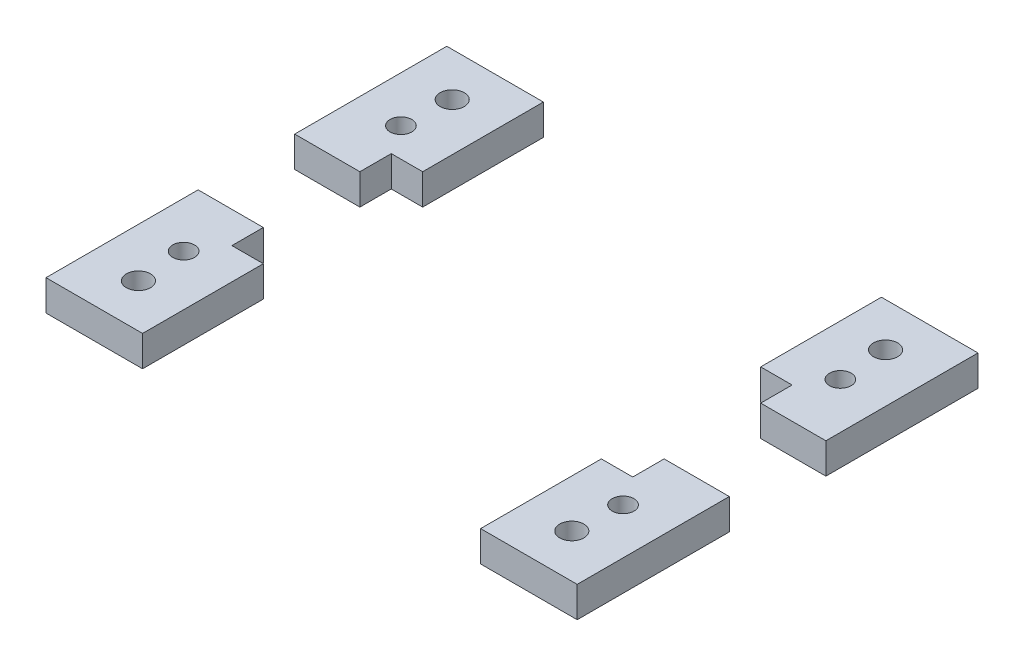
ISO-10303-21;
HEADER;
FILE_DESCRIPTION(('STEP AP214'),'2;1');
FILE_NAME('part.step','',(''),(''),'','','');
FILE_SCHEMA(('AUTOMOTIVE_DESIGN { 1 0 10303 214 1 1 1 1 }'));
ENDSEC;
DATA;
#1=APPLICATION_CONTEXT('core data for automotive mechanical design processes');
#2=APPLICATION_PROTOCOL_DEFINITION('international standard','automotive_design',2000,#1);
#3=PRODUCT_CONTEXT('',#1,'mechanical');
#4=PRODUCT('Part','Part','',(#3));
#5=PRODUCT_RELATED_PRODUCT_CATEGORY('part','',(#4));
#6=PRODUCT_DEFINITION_FORMATION('','',#4);
#7=PRODUCT_DEFINITION_CONTEXT('part definition',#1,'design');
#8=PRODUCT_DEFINITION('design','',#6,#7);
#9=PRODUCT_DEFINITION_SHAPE('','',#8);
#10=(LENGTH_UNIT() NAMED_UNIT(*) SI_UNIT(.MILLI.,.METRE.));
#11=(NAMED_UNIT(*) PLANE_ANGLE_UNIT() SI_UNIT($,.RADIAN.));
#12=(NAMED_UNIT(*) SI_UNIT($,.STERADIAN.) SOLID_ANGLE_UNIT());
#13=UNCERTAINTY_MEASURE_WITH_UNIT(LENGTH_MEASURE(1.E-05),#10,'distance_accuracy_value','');
#14=(GEOMETRIC_REPRESENTATION_CONTEXT(3) GLOBAL_UNCERTAINTY_ASSIGNED_CONTEXT((#13)) GLOBAL_UNIT_ASSIGNED_CONTEXT((#10,
#11,#12)) REPRESENTATION_CONTEXT('',''));
#15=CARTESIAN_POINT('',(0.,0.,0.));
#16=DIRECTION('',(0.,0.,1.));
#17=DIRECTION('',(1.,0.,0.));
#18=AXIS2_PLACEMENT_3D('',#15,#16,#17);
#19=CARTESIAN_POINT('',(-41.5,-3.175,-41.5));
#20=DIRECTION('',(0.,0.,-1.));
#21=DIRECTION('',(-1.,0.,0.));
#22=AXIS2_PLACEMENT_3D('',#19,#20,#21);
#23=PLANE('',#22);
#24=DIRECTION('',(0.,-1.,0.));
#25=VECTOR('',#24,1.);
#26=CARTESIAN_POINT('',(-55.,3.175,-41.5));
#27=LINE('',#26,#25);
#28=CARTESIAN_POINT('',(-55.,3.175,-41.5));
#29=VERTEX_POINT('',#28);
#30=CARTESIAN_POINT('',(-55.,-3.175,-41.5));
#31=VERTEX_POINT('',#30);
#32=EDGE_CURVE('E486',#29,#31,#27,.T.);
#33=ORIENTED_EDGE('',*,*,#32,.F.);
#34=DIRECTION('',(-1.,0.,0.));
#35=VECTOR('',#34,1.);
#36=CARTESIAN_POINT('',(-41.5,3.175,-41.5));
#37=LINE('',#36,#35);
#38=CARTESIAN_POINT('',(-35.,3.175,-41.5));
#39=VERTEX_POINT('',#38);
#40=EDGE_CURVE('E559',#39,#29,#37,.T.);
#41=ORIENTED_EDGE('',*,*,#40,.F.);
#42=DIRECTION('',(0.,1.,0.));
#43=VECTOR('',#42,1.);
#44=CARTESIAN_POINT('',(-35.,-3.175,-41.5));
#45=LINE('',#44,#43);
#46=CARTESIAN_POINT('',(-35.,-3.175,-41.5));
#47=VERTEX_POINT('',#46);
#48=EDGE_CURVE('E569',#47,#39,#45,.T.);
#49=ORIENTED_EDGE('',*,*,#48,.F.);
#50=DIRECTION('',(-1.,0.,0.));
#51=VECTOR('',#50,1.);
#52=CARTESIAN_POINT('',(-41.5,-3.175,-41.5));
#53=LINE('',#52,#51);
#54=EDGE_CURVE('E556',#47,#31,#53,.T.);
#55=ORIENTED_EDGE('',*,*,#54,.T.);
#56=EDGE_LOOP('',(#33,#41,#49,#55));
#57=FACE_BOUND('',#56,.T.);
#58=ADVANCED_FACE('F476',(#57),#23,.T.);
#59=CARTESIAN_POINT('',(0.,-3.175,0.));
#60=DIRECTION('',(0.,1.,0.));
#61=DIRECTION('',(0.,0.,1.));
#62=AXIS2_PLACEMENT_3D('',#59,#60,#61);
#63=PLANE('',#62);
#64=CARTESIAN_POINT('',(-45.5,-3.175,-22.5));
#65=DIRECTION('',(0.,1.,0.));
#66=DIRECTION('',(0.,0.,1.));
#67=AXIS2_PLACEMENT_3D('',#64,#65,#66);
#68=CIRCLE('',#67,2.25);
#69=CARTESIAN_POINT('',(-45.5,-3.175,-20.25));
#70=VERTEX_POINT('',#69);
#71=EDGE_CURVE('E583',#70,#70,#68,.T.);
#72=ORIENTED_EDGE('',*,*,#71,.T.);
#73=EDGE_LOOP('',(#72));
#74=FACE_BOUND('',#73,.T.);
#75=CARTESIAN_POINT('',(-44.8716223944726,-3.175,-32.4880942852371));
#76=DIRECTION('',(0.,1.,0.));
#77=DIRECTION('',(0.,0.,1.));
#78=AXIS2_PLACEMENT_3D('',#75,#76,#77);
#79=CIRCLE('',#78,2.5);
#80=CARTESIAN_POINT('',(-44.8716223944726,-3.175,-29.9880942852371));
#81=VERTEX_POINT('',#80);
#82=EDGE_CURVE('E584',#81,#81,#79,.T.);
#83=ORIENTED_EDGE('',*,*,#82,.T.);
#84=EDGE_LOOP('',(#83));
#85=FACE_BOUND('',#84,.T.);
#86=DIRECTION('',(0.,0.,1.));
#87=VECTOR('',#86,1.);
#88=CARTESIAN_POINT('',(-41.5,-3.175,-16.5));
#89=LINE('',#88,#87);
#90=CARTESIAN_POINT('',(-41.5,-3.175,-16.5));
#91=VERTEX_POINT('',#90);
#92=CARTESIAN_POINT('',(-41.5,-3.175,-10.));
#93=VERTEX_POINT('',#92);
#94=EDGE_CURVE('E480',#91,#93,#89,.T.);
#95=ORIENTED_EDGE('',*,*,#94,.T.);
#96=DIRECTION('',(1.,0.,0.));
#97=VECTOR('',#96,1.);
#98=CARTESIAN_POINT('',(0.,-3.175,-10.));
#99=LINE('',#98,#97);
#100=CARTESIAN_POINT('',(-55.,-3.175,-10.));
#101=VERTEX_POINT('',#100);
#102=EDGE_CURVE('E530',#101,#93,#99,.T.);
#103=ORIENTED_EDGE('',*,*,#102,.F.);
#104=DIRECTION('',(0.,0.,1.));
#105=VECTOR('',#104,1.);
#106=CARTESIAN_POINT('',(-55.,-3.175,0.));
#107=LINE('',#106,#105);
#108=EDGE_CURVE('E13',#31,#101,#107,.T.);
#109=ORIENTED_EDGE('',*,*,#108,.F.);
#110=ORIENTED_EDGE('',*,*,#54,.F.);
#111=DIRECTION('',(0.,0.,-1.));
#112=VECTOR('',#111,1.);
#113=CARTESIAN_POINT('',(-35.,-3.175,0.));
#114=LINE('',#113,#112);
#115=CARTESIAN_POINT('',(-35.,-3.175,-16.5));
#116=VERTEX_POINT('',#115);
#117=EDGE_CURVE('E533',#116,#47,#114,.T.);
#118=ORIENTED_EDGE('',*,*,#117,.F.);
#119=DIRECTION('',(-1.,0.,0.));
#120=VECTOR('',#119,1.);
#121=CARTESIAN_POINT('',(-41.5,-3.175,-16.5));
#122=LINE('',#121,#120);
#123=EDGE_CURVE('E547',#116,#91,#122,.T.);
#124=ORIENTED_EDGE('',*,*,#123,.T.);
#125=EDGE_LOOP('',(#95,#103,#109,#110,#118,#124));
#126=FACE_BOUND('',#125,.T.);
#127=ADVANCED_FACE('F478',(#74,#85,#126),#63,.F.);
#128=CARTESIAN_POINT('',(-41.5,-3.175,-16.5));
#129=DIRECTION('',(-1.,0.,0.));
#130=DIRECTION('',(0.,0.,1.));
#131=AXIS2_PLACEMENT_3D('',#128,#129,#130);
#132=PLANE('',#131);
#133=DIRECTION('',(0.,0.,1.));
#134=VECTOR('',#133,1.);
#135=CARTESIAN_POINT('',(-41.5,3.175,-16.5));
#136=LINE('',#135,#134);
#137=CARTESIAN_POINT('',(-41.5,3.175,-16.5));
#138=VERTEX_POINT('',#137);
#139=CARTESIAN_POINT('',(-41.5,3.175,-10.));
#140=VERTEX_POINT('',#139);
#141=EDGE_CURVE('E544',#138,#140,#136,.T.);
#142=ORIENTED_EDGE('',*,*,#141,.T.);
#143=DIRECTION('',(0.,-1.,0.));
#144=VECTOR('',#143,1.);
#145=CARTESIAN_POINT('',(-41.5,-3.175,-10.));
#146=LINE('',#145,#144);
#147=EDGE_CURVE('E546',#140,#93,#146,.T.);
#148=ORIENTED_EDGE('',*,*,#147,.T.);
#149=ORIENTED_EDGE('',*,*,#94,.F.);
#150=DIRECTION('',(0.,1.,0.));
#151=VECTOR('',#150,1.);
#152=CARTESIAN_POINT('',(-41.5,-3.175,-16.5));
#153=LINE('',#152,#151);
#154=EDGE_CURVE('E551',#91,#138,#153,.T.);
#155=ORIENTED_EDGE('',*,*,#154,.T.);
#156=EDGE_LOOP('',(#142,#148,#149,#155));
#157=FACE_BOUND('',#156,.T.);
#158=ADVANCED_FACE('F610',(#157),#132,.F.);
#159=CARTESIAN_POINT('',(-41.5,-3.175,-16.5));
#160=DIRECTION('',(0.,0.,-1.));
#161=DIRECTION('',(-1.,0.,0.));
#162=AXIS2_PLACEMENT_3D('',#159,#160,#161);
#163=PLANE('',#162);
#164=ORIENTED_EDGE('',*,*,#123,.F.);
#165=DIRECTION('',(0.,1.,0.));
#166=VECTOR('',#165,1.);
#167=CARTESIAN_POINT('',(-35.,-3.175,-16.5));
#168=LINE('',#167,#166);
#169=CARTESIAN_POINT('',(-35.,3.175,-16.5));
#170=VERTEX_POINT('',#169);
#171=EDGE_CURVE('E565',#116,#170,#168,.T.);
#172=ORIENTED_EDGE('',*,*,#171,.T.);
#173=DIRECTION('',(-1.,0.,0.));
#174=VECTOR('',#173,1.);
#175=CARTESIAN_POINT('',(-41.5,3.175,-16.5));
#176=LINE('',#175,#174);
#177=EDGE_CURVE('E568',#170,#138,#176,.T.);
#178=ORIENTED_EDGE('',*,*,#177,.T.);
#179=ORIENTED_EDGE('',*,*,#154,.F.);
#180=EDGE_LOOP('',(#164,#172,#178,#179));
#181=FACE_BOUND('',#180,.T.);
#182=ADVANCED_FACE('F612',(#181),#163,.F.);
#183=CARTESIAN_POINT('',(0.,3.175,0.));
#184=DIRECTION('',(0.,1.,0.));
#185=DIRECTION('',(0.,0.,1.));
#186=AXIS2_PLACEMENT_3D('',#183,#184,#185);
#187=PLANE('',#186);
#188=CARTESIAN_POINT('',(-45.5,3.175,-22.5));
#189=DIRECTION('',(0.,1.,0.));
#190=DIRECTION('',(0.,0.,1.));
#191=AXIS2_PLACEMENT_3D('',#188,#189,#190);
#192=CIRCLE('',#191,2.25);
#193=CARTESIAN_POINT('',(-45.5,3.175,-20.25));
#194=VERTEX_POINT('',#193);
#195=EDGE_CURVE('E562',#194,#194,#192,.T.);
#196=ORIENTED_EDGE('',*,*,#195,.F.);
#197=EDGE_LOOP('',(#196));
#198=FACE_BOUND('',#197,.T.);
#199=CARTESIAN_POINT('',(-44.8716223944726,3.175,-32.4880942852371));
#200=DIRECTION('',(0.,1.,0.));
#201=DIRECTION('',(0.,0.,1.));
#202=AXIS2_PLACEMENT_3D('',#199,#200,#201);
#203=CIRCLE('',#202,2.5);
#204=CARTESIAN_POINT('',(-44.8716223944726,3.175,-29.9880942852371));
#205=VERTEX_POINT('',#204);
#206=EDGE_CURVE('E580',#205,#205,#203,.T.);
#207=ORIENTED_EDGE('',*,*,#206,.F.);
#208=EDGE_LOOP('',(#207));
#209=FACE_BOUND('',#208,.T.);
#210=DIRECTION('',(1.,0.,0.));
#211=VECTOR('',#210,1.);
#212=CARTESIAN_POINT('',(0.,3.175,-10.));
#213=LINE('',#212,#211);
#214=CARTESIAN_POINT('',(-55.,3.175,-10.));
#215=VERTEX_POINT('',#214);
#216=EDGE_CURVE('E525',#215,#140,#213,.T.);
#217=ORIENTED_EDGE('',*,*,#216,.T.);
#218=ORIENTED_EDGE('',*,*,#141,.F.);
#219=ORIENTED_EDGE('',*,*,#177,.F.);
#220=DIRECTION('',(0.,0.,1.));
#221=VECTOR('',#220,1.);
#222=CARTESIAN_POINT('',(-35.,3.175,0.));
#223=LINE('',#222,#221);
#224=EDGE_CURVE('E564',#39,#170,#223,.T.);
#225=ORIENTED_EDGE('',*,*,#224,.F.);
#226=ORIENTED_EDGE('',*,*,#40,.T.);
#227=DIRECTION('',(0.,0.,1.));
#228=VECTOR('',#227,1.);
#229=CARTESIAN_POINT('',(-55.,3.175,0.));
#230=LINE('',#229,#228);
#231=EDGE_CURVE('E571',#29,#215,#230,.T.);
#232=ORIENTED_EDGE('',*,*,#231,.T.);
#233=EDGE_LOOP('',(#217,#218,#219,#225,#226,#232));
#234=FACE_BOUND('',#233,.T.);
#235=ADVANCED_FACE('F615',(#198,#209,#234),#187,.T.);
#236=CARTESIAN_POINT('',(-35.,3.175,0.));
#237=DIRECTION('',(-1.,0.,0.));
#238=DIRECTION('',(0.,0.,1.));
#239=AXIS2_PLACEMENT_3D('',#236,#237,#238);
#240=PLANE('',#239);
#241=ORIENTED_EDGE('',*,*,#48,.T.);
#242=ORIENTED_EDGE('',*,*,#224,.T.);
#243=ORIENTED_EDGE('',*,*,#171,.F.);
#244=ORIENTED_EDGE('',*,*,#117,.T.);
#245=EDGE_LOOP('',(#241,#242,#243,#244));
#246=FACE_BOUND('',#245,.T.);
#247=ADVANCED_FACE('F616',(#246),#240,.F.);
#248=CARTESIAN_POINT('',(0.,3.175,-10.));
#249=DIRECTION('',(0.,0.,-1.));
#250=DIRECTION('',(-1.,0.,0.));
#251=AXIS2_PLACEMENT_3D('',#248,#249,#250);
#252=PLANE('',#251);
#253=ORIENTED_EDGE('',*,*,#216,.F.);
#254=DIRECTION('',(0.,-1.,0.));
#255=VECTOR('',#254,1.);
#256=CARTESIAN_POINT('',(-55.,3.175,-10.));
#257=LINE('',#256,#255);
#258=EDGE_CURVE('E527',#215,#101,#257,.T.);
#259=ORIENTED_EDGE('',*,*,#258,.T.);
#260=ORIENTED_EDGE('',*,*,#102,.T.);
#261=ORIENTED_EDGE('',*,*,#147,.F.);
#262=EDGE_LOOP('',(#253,#259,#260,#261));
#263=FACE_BOUND('',#262,.T.);
#264=ADVANCED_FACE('F528',(#263),#252,.F.);
#265=CARTESIAN_POINT('',(-55.,3.175,0.));
#266=DIRECTION('',(1.,0.,0.));
#267=DIRECTION('',(0.,0.,-1.));
#268=AXIS2_PLACEMENT_3D('',#265,#266,#267);
#269=PLANE('',#268);
#270=ORIENTED_EDGE('',*,*,#258,.F.);
#271=ORIENTED_EDGE('',*,*,#231,.F.);
#272=ORIENTED_EDGE('',*,*,#32,.T.);
#273=ORIENTED_EDGE('',*,*,#108,.T.);
#274=EDGE_LOOP('',(#270,#271,#272,#273));
#275=FACE_BOUND('',#274,.T.);
#276=ADVANCED_FACE('F535',(#275),#269,.F.);
#277=CARTESIAN_POINT('',(-44.8716223944726,3.175,-32.4880942852371));
#278=DIRECTION('',(0.,-1.,0.));
#279=DIRECTION('',(0.,0.,-1.));
#280=AXIS2_PLACEMENT_3D('',#277,#278,#279);
#281=CYLINDRICAL_SURFACE('',#280,2.5);
#282=ORIENTED_EDGE('',*,*,#206,.T.);
#283=EDGE_LOOP('',(#282));
#284=FACE_BOUND('',#283,.T.);
#285=ORIENTED_EDGE('',*,*,#82,.F.);
#286=EDGE_LOOP('',(#285));
#287=FACE_BOUND('',#286,.T.);
#288=ADVANCED_FACE('F596',(#284,#287),#281,.F.);
#289=CARTESIAN_POINT('',(-45.5,3.175,-22.5));
#290=DIRECTION('',(0.,-1.,0.));
#291=DIRECTION('',(0.,0.,-1.));
#292=AXIS2_PLACEMENT_3D('',#289,#290,#291);
#293=CYLINDRICAL_SURFACE('',#292,2.25);
#294=ORIENTED_EDGE('',*,*,#195,.T.);
#295=EDGE_LOOP('',(#294));
#296=FACE_BOUND('',#295,.T.);
#297=ORIENTED_EDGE('',*,*,#71,.F.);
#298=EDGE_LOOP('',(#297));
#299=FACE_BOUND('',#298,.T.);
#300=ADVANCED_FACE('F594',(#296,#299),#293,.F.);
#301=CLOSED_SHELL('',(#58,#127,#158,#182,#235,#247,#264,#276,#288,#300));
#302=MANIFOLD_SOLID_BREP('B2',#301);
#303=CARTESIAN_POINT('',(41.5,-3.175,-16.5));
#304=DIRECTION('',(1.,0.,0.));
#305=DIRECTION('',(0.,0.,-1.));
#306=AXIS2_PLACEMENT_3D('',#303,#304,#305);
#307=PLANE('',#306);
#308=DIRECTION('',(0.,1.,0.));
#309=VECTOR('',#308,1.);
#310=CARTESIAN_POINT('',(41.5,-3.175,10.));
#311=LINE('',#310,#309);
#312=CARTESIAN_POINT('',(41.5,-3.175,10.));
#313=VERTEX_POINT('',#312);
#314=CARTESIAN_POINT('',(41.5,3.175,10.));
#315=VERTEX_POINT('',#314);
#316=EDGE_CURVE('E797',#313,#315,#311,.T.);
#317=ORIENTED_EDGE('',*,*,#316,.F.);
#318=DIRECTION('',(0.,0.,-1.));
#319=VECTOR('',#318,1.);
#320=CARTESIAN_POINT('',(41.5,-3.175,-16.5));
#321=LINE('',#320,#319);
#322=CARTESIAN_POINT('',(41.5,-3.175,16.5));
#323=VERTEX_POINT('',#322);
#324=EDGE_CURVE('E794',#323,#313,#321,.T.);
#325=ORIENTED_EDGE('',*,*,#324,.F.);
#326=DIRECTION('',(0.,1.,0.));
#327=VECTOR('',#326,1.);
#328=CARTESIAN_POINT('',(41.5,-3.175,16.5));
#329=LINE('',#328,#327);
#330=CARTESIAN_POINT('',(41.5,3.175,16.5));
#331=VERTEX_POINT('',#330);
#332=EDGE_CURVE('E789',#323,#331,#329,.T.);
#333=ORIENTED_EDGE('',*,*,#332,.T.);
#334=DIRECTION('',(0.,0.,-1.));
#335=VECTOR('',#334,1.);
#336=CARTESIAN_POINT('',(41.5,3.175,-16.5));
#337=LINE('',#336,#335);
#338=EDGE_CURVE('E707',#331,#315,#337,.T.);
#339=ORIENTED_EDGE('',*,*,#338,.T.);
#340=EDGE_LOOP('',(#317,#325,#333,#339));
#341=FACE_BOUND('',#340,.T.);
#342=ADVANCED_FACE('F704',(#341),#307,.F.);
#343=CARTESIAN_POINT('',(0.,3.175,0.));
#344=DIRECTION('',(0.,1.,0.));
#345=DIRECTION('',(0.,0.,1.));
#346=AXIS2_PLACEMENT_3D('',#343,#344,#345);
#347=PLANE('',#346);
#348=CARTESIAN_POINT('',(45.5,3.175,22.5));
#349=DIRECTION('',(0.,1.,0.));
#350=DIRECTION('',(0.,0.,1.));
#351=AXIS2_PLACEMENT_3D('',#348,#349,#350);
#352=CIRCLE('',#351,2.25000000000001);
#353=CARTESIAN_POINT('',(45.5,3.175,24.75));
#354=VERTEX_POINT('',#353);
#355=EDGE_CURVE('E792',#354,#354,#352,.T.);
#356=ORIENTED_EDGE('',*,*,#355,.F.);
#357=EDGE_LOOP('',(#356));
#358=FACE_BOUND('',#357,.T.);
#359=CARTESIAN_POINT('',(44.8716223944726,3.175,32.4880942852371));
#360=DIRECTION('',(0.,1.,0.));
#361=DIRECTION('',(0.,0.,1.));
#362=AXIS2_PLACEMENT_3D('',#359,#360,#361);
#363=CIRCLE('',#362,2.5);
#364=CARTESIAN_POINT('',(44.8716223944726,3.175,34.9880942852371));
#365=VERTEX_POINT('',#364);
#366=EDGE_CURVE('E908',#365,#365,#363,.T.);
#367=ORIENTED_EDGE('',*,*,#366,.F.);
#368=EDGE_LOOP('',(#367));
#369=FACE_BOUND('',#368,.T.);
#370=DIRECTION('',(0.,0.,-1.));
#371=VECTOR('',#370,1.);
#372=CARTESIAN_POINT('',(55.,3.175,0.));
#373=LINE('',#372,#371);
#374=CARTESIAN_POINT('',(55.,3.175,41.5));
#375=VERTEX_POINT('',#374);
#376=CARTESIAN_POINT('',(55.,3.175,10.));
#377=VERTEX_POINT('',#376);
#378=EDGE_CURVE('E741',#375,#377,#373,.T.);
#379=ORIENTED_EDGE('',*,*,#378,.T.);
#380=DIRECTION('',(1.,0.,0.));
#381=VECTOR('',#380,1.);
#382=CARTESIAN_POINT('',(0.,3.175,10.));
#383=LINE('',#382,#381);
#384=EDGE_CURVE('E713',#315,#377,#383,.T.);
#385=ORIENTED_EDGE('',*,*,#384,.F.);
#386=ORIENTED_EDGE('',*,*,#338,.F.);
#387=DIRECTION('',(1.,0.,0.));
#388=VECTOR('',#387,1.);
#389=CARTESIAN_POINT('',(-41.5,3.175,16.5));
#390=LINE('',#389,#388);
#391=CARTESIAN_POINT('',(35.,3.175,16.5));
#392=VERTEX_POINT('',#391);
#393=EDGE_CURVE('E779',#392,#331,#390,.T.);
#394=ORIENTED_EDGE('',*,*,#393,.F.);
#395=DIRECTION('',(0.,0.,1.));
#396=VECTOR('',#395,1.);
#397=CARTESIAN_POINT('',(35.,3.175,0.));
#398=LINE('',#397,#396);
#399=CARTESIAN_POINT('',(35.,3.175,41.5));
#400=VERTEX_POINT('',#399);
#401=EDGE_CURVE('E787',#392,#400,#398,.T.);
#402=ORIENTED_EDGE('',*,*,#401,.T.);
#403=DIRECTION('',(1.,0.,0.));
#404=VECTOR('',#403,1.);
#405=CARTESIAN_POINT('',(-41.5,3.175,41.5));
#406=LINE('',#405,#404);
#407=EDGE_CURVE('E778',#400,#375,#406,.T.);
#408=ORIENTED_EDGE('',*,*,#407,.T.);
#409=EDGE_LOOP('',(#379,#385,#386,#394,#402,#408));
#410=FACE_BOUND('',#409,.T.);
#411=ADVANCED_FACE('F812',(#358,#369,#410),#347,.T.);
#412=CARTESIAN_POINT('',(0.,-3.175,0.));
#413=DIRECTION('',(0.,1.,0.));
#414=DIRECTION('',(0.,0.,1.));
#415=AXIS2_PLACEMENT_3D('',#412,#413,#414);
#416=PLANE('',#415);
#417=CARTESIAN_POINT('',(45.5,-3.175,22.5));
#418=DIRECTION('',(0.,1.,0.));
#419=DIRECTION('',(0.,0.,1.));
#420=AXIS2_PLACEMENT_3D('',#417,#418,#419);
#421=CIRCLE('',#420,2.25000000000001);
#422=CARTESIAN_POINT('',(45.5,-3.175,24.75));
#423=VERTEX_POINT('',#422);
#424=EDGE_CURVE('E907',#423,#423,#421,.T.);
#425=ORIENTED_EDGE('',*,*,#424,.T.);
#426=EDGE_LOOP('',(#425));
#427=FACE_BOUND('',#426,.T.);
#428=CARTESIAN_POINT('',(44.8716223944726,-3.175,32.4880942852371));
#429=DIRECTION('',(0.,1.,0.));
#430=DIRECTION('',(0.,0.,1.));
#431=AXIS2_PLACEMENT_3D('',#428,#429,#430);
#432=CIRCLE('',#431,2.5);
#433=CARTESIAN_POINT('',(44.8716223944726,-3.175,34.9880942852371));
#434=VERTEX_POINT('',#433);
#435=EDGE_CURVE('E912',#434,#434,#432,.T.);
#436=ORIENTED_EDGE('',*,*,#435,.T.);
#437=EDGE_LOOP('',(#436));
#438=FACE_BOUND('',#437,.T.);
#439=DIRECTION('',(1.,0.,0.));
#440=VECTOR('',#439,1.);
#441=CARTESIAN_POINT('',(0.,-3.175,10.));
#442=LINE('',#441,#440);
#443=CARTESIAN_POINT('',(55.,-3.175,10.));
#444=VERTEX_POINT('',#443);
#445=EDGE_CURVE('E720',#313,#444,#442,.T.);
#446=ORIENTED_EDGE('',*,*,#445,.T.);
#447=DIRECTION('',(0.,0.,-1.));
#448=VECTOR('',#447,1.);
#449=CARTESIAN_POINT('',(55.,-3.175,0.));
#450=LINE('',#449,#448);
#451=CARTESIAN_POINT('',(55.,-3.175,41.5));
#452=VERTEX_POINT('',#451);
#453=EDGE_CURVE('E782',#452,#444,#450,.T.);
#454=ORIENTED_EDGE('',*,*,#453,.F.);
#455=DIRECTION('',(1.,0.,0.));
#456=VECTOR('',#455,1.);
#457=CARTESIAN_POINT('',(-41.5,-3.175,41.5));
#458=LINE('',#457,#456);
#459=CARTESIAN_POINT('',(35.,-3.175,41.5));
#460=VERTEX_POINT('',#459);
#461=EDGE_CURVE('E776',#460,#452,#458,.T.);
#462=ORIENTED_EDGE('',*,*,#461,.F.);
#463=DIRECTION('',(0.,0.,-1.));
#464=VECTOR('',#463,1.);
#465=CARTESIAN_POINT('',(35.,-3.175,0.));
#466=LINE('',#465,#464);
#467=CARTESIAN_POINT('',(35.,-3.175,16.5));
#468=VERTEX_POINT('',#467);
#469=EDGE_CURVE('E760',#460,#468,#466,.T.);
#470=ORIENTED_EDGE('',*,*,#469,.T.);
#471=DIRECTION('',(1.,0.,0.));
#472=VECTOR('',#471,1.);
#473=CARTESIAN_POINT('',(-41.5,-3.175,16.5));
#474=LINE('',#473,#472);
#475=EDGE_CURVE('E770',#468,#323,#474,.T.);
#476=ORIENTED_EDGE('',*,*,#475,.T.);
#477=ORIENTED_EDGE('',*,*,#324,.T.);
#478=EDGE_LOOP('',(#446,#454,#462,#470,#476,#477));
#479=FACE_BOUND('',#478,.T.);
#480=ADVANCED_FACE('F781',(#427,#438,#479),#416,.F.);
#481=CARTESIAN_POINT('',(-41.5,-3.175,16.5));
#482=DIRECTION('',(0.,0.,1.));
#483=DIRECTION('',(1.,0.,0.));
#484=AXIS2_PLACEMENT_3D('',#481,#482,#483);
#485=PLANE('',#484);
#486=DIRECTION('',(0.,-1.,0.));
#487=VECTOR('',#486,1.);
#488=CARTESIAN_POINT('',(35.,-3.175,16.5));
#489=LINE('',#488,#487);
#490=EDGE_CURVE('E766',#392,#468,#489,.T.);
#491=ORIENTED_EDGE('',*,*,#490,.F.);
#492=ORIENTED_EDGE('',*,*,#393,.T.);
#493=ORIENTED_EDGE('',*,*,#332,.F.);
#494=ORIENTED_EDGE('',*,*,#475,.F.);
#495=EDGE_LOOP('',(#491,#492,#493,#494));
#496=FACE_BOUND('',#495,.T.);
#497=ADVANCED_FACE('F815',(#496),#485,.F.);
#498=CARTESIAN_POINT('',(-41.5,-3.175,41.5));
#499=DIRECTION('',(0.,0.,1.));
#500=DIRECTION('',(1.,0.,0.));
#501=AXIS2_PLACEMENT_3D('',#498,#499,#500);
#502=PLANE('',#501);
#503=DIRECTION('',(0.,-1.,0.));
#504=VECTOR('',#503,1.);
#505=CARTESIAN_POINT('',(55.,3.175,41.5));
#506=LINE('',#505,#504);
#507=EDGE_CURVE('E735',#375,#452,#506,.T.);
#508=ORIENTED_EDGE('',*,*,#507,.F.);
#509=ORIENTED_EDGE('',*,*,#407,.F.);
#510=DIRECTION('',(0.,-1.,0.));
#511=VECTOR('',#510,1.);
#512=CARTESIAN_POINT('',(35.,-3.175,41.5));
#513=LINE('',#512,#511);
#514=EDGE_CURVE('E763',#400,#460,#513,.T.);
#515=ORIENTED_EDGE('',*,*,#514,.T.);
#516=ORIENTED_EDGE('',*,*,#461,.T.);
#517=EDGE_LOOP('',(#508,#509,#515,#516));
#518=FACE_BOUND('',#517,.T.);
#519=ADVANCED_FACE('F775',(#518),#502,.T.);
#520=CARTESIAN_POINT('',(35.,3.175,0.));
#521=DIRECTION('',(-1.,0.,0.));
#522=DIRECTION('',(0.,0.,1.));
#523=AXIS2_PLACEMENT_3D('',#520,#521,#522);
#524=PLANE('',#523);
#525=ORIENTED_EDGE('',*,*,#401,.F.);
#526=ORIENTED_EDGE('',*,*,#490,.T.);
#527=ORIENTED_EDGE('',*,*,#469,.F.);
#528=ORIENTED_EDGE('',*,*,#514,.F.);
#529=EDGE_LOOP('',(#525,#526,#527,#528));
#530=FACE_BOUND('',#529,.T.);
#531=ADVANCED_FACE('F762',(#530),#524,.T.);
#532=CARTESIAN_POINT('',(55.,3.175,0.));
#533=DIRECTION('',(-1.,0.,0.));
#534=DIRECTION('',(0.,0.,1.));
#535=AXIS2_PLACEMENT_3D('',#532,#533,#534);
#536=PLANE('',#535);
#537=DIRECTION('',(0.,-1.,0.));
#538=VECTOR('',#537,1.);
#539=CARTESIAN_POINT('',(55.,3.175,10.));
#540=LINE('',#539,#538);
#541=EDGE_CURVE('E474',#377,#444,#540,.T.);
#542=ORIENTED_EDGE('',*,*,#541,.F.);
#543=ORIENTED_EDGE('',*,*,#378,.F.);
#544=ORIENTED_EDGE('',*,*,#507,.T.);
#545=ORIENTED_EDGE('',*,*,#453,.T.);
#546=EDGE_LOOP('',(#542,#543,#544,#545));
#547=FACE_BOUND('',#546,.T.);
#548=ADVANCED_FACE('F836',(#547),#536,.F.);
#549=CARTESIAN_POINT('',(0.,3.175,10.));
#550=DIRECTION('',(0.,0.,-1.));
#551=DIRECTION('',(-1.,0.,0.));
#552=AXIS2_PLACEMENT_3D('',#549,#550,#551);
#553=PLANE('',#552);
#554=ORIENTED_EDGE('',*,*,#316,.T.);
#555=ORIENTED_EDGE('',*,*,#384,.T.);
#556=ORIENTED_EDGE('',*,*,#541,.T.);
#557=ORIENTED_EDGE('',*,*,#445,.F.);
#558=EDGE_LOOP('',(#554,#555,#556,#557));
#559=FACE_BOUND('',#558,.T.);
#560=ADVANCED_FACE('F810',(#559),#553,.T.);
#561=CARTESIAN_POINT('',(44.8716223944726,3.175,32.4880942852371));
#562=DIRECTION('',(0.,-1.,0.));
#563=DIRECTION('',(0.,0.,-1.));
#564=AXIS2_PLACEMENT_3D('',#561,#562,#563);
#565=CYLINDRICAL_SURFACE('',#564,2.5);
#566=ORIENTED_EDGE('',*,*,#366,.T.);
#567=EDGE_LOOP('',(#566));
#568=FACE_BOUND('',#567,.T.);
#569=ORIENTED_EDGE('',*,*,#435,.F.);
#570=EDGE_LOOP('',(#569));
#571=FACE_BOUND('',#570,.T.);
#572=ADVANCED_FACE('F840',(#568,#571),#565,.F.);
#573=CARTESIAN_POINT('',(45.5,3.175,22.5));
#574=DIRECTION('',(0.,-1.,0.));
#575=DIRECTION('',(0.,0.,-1.));
#576=AXIS2_PLACEMENT_3D('',#573,#574,#575);
#577=CYLINDRICAL_SURFACE('',#576,2.25000000000001);
#578=ORIENTED_EDGE('',*,*,#355,.T.);
#579=EDGE_LOOP('',(#578));
#580=FACE_BOUND('',#579,.T.);
#581=ORIENTED_EDGE('',*,*,#424,.F.);
#582=EDGE_LOOP('',(#581));
#583=FACE_BOUND('',#582,.T.);
#584=ADVANCED_FACE('F860',(#580,#583),#577,.F.);
#585=CLOSED_SHELL('',(#342,#411,#480,#497,#519,#531,#548,#560,#572,#584));
#586=MANIFOLD_SOLID_BREP('B7',#585);
#587=CARTESIAN_POINT('',(-41.5,-3.175,16.5));
#588=DIRECTION('',(0.,0.,1.));
#589=DIRECTION('',(1.,0.,0.));
#590=AXIS2_PLACEMENT_3D('',#587,#588,#589);
#591=PLANE('',#590);
#592=DIRECTION('',(1.,0.,0.));
#593=VECTOR('',#592,1.);
#594=CARTESIAN_POINT('',(-41.5,3.175,16.5));
#595=LINE('',#594,#593);
#596=CARTESIAN_POINT('',(-41.5,3.175,16.5));
#597=VERTEX_POINT('',#596);
#598=CARTESIAN_POINT('',(-35.,3.175,16.5));
#599=VERTEX_POINT('',#598);
#600=EDGE_CURVE('E935',#597,#599,#595,.T.);
#601=ORIENTED_EDGE('',*,*,#600,.T.);
#602=DIRECTION('',(0.,-1.,0.));
#603=VECTOR('',#602,1.);
#604=CARTESIAN_POINT('',(-35.,-3.175,16.5));
#605=LINE('',#604,#603);
#606=CARTESIAN_POINT('',(-35.,-3.175,16.5));
#607=VERTEX_POINT('',#606);
#608=EDGE_CURVE('E1024',#599,#607,#605,.T.);
#609=ORIENTED_EDGE('',*,*,#608,.T.);
#610=DIRECTION('',(1.,0.,0.));
#611=VECTOR('',#610,1.);
#612=CARTESIAN_POINT('',(-41.5,-3.175,16.5));
#613=LINE('',#612,#611);
#614=CARTESIAN_POINT('',(-41.5,-3.175,16.5));
#615=VERTEX_POINT('',#614);
#616=EDGE_CURVE('E1009',#615,#607,#613,.T.);
#617=ORIENTED_EDGE('',*,*,#616,.F.);
#618=DIRECTION('',(0.,1.,0.));
#619=VECTOR('',#618,1.);
#620=CARTESIAN_POINT('',(-41.5,-3.175,16.5));
#621=LINE('',#620,#619);
#622=EDGE_CURVE('E1018',#615,#597,#621,.T.);
#623=ORIENTED_EDGE('',*,*,#622,.T.);
#624=EDGE_LOOP('',(#601,#609,#617,#623));
#625=FACE_BOUND('',#624,.T.);
#626=ADVANCED_FACE('F931',(#625),#591,.F.);
#627=CARTESIAN_POINT('',(-35.,3.175,0.));
#628=DIRECTION('',(-1.,0.,0.));
#629=DIRECTION('',(0.,0.,1.));
#630=AXIS2_PLACEMENT_3D('',#627,#628,#629);
#631=PLANE('',#630);
#632=DIRECTION('',(0.,-1.,0.));
#633=VECTOR('',#632,1.);
#634=CARTESIAN_POINT('',(-35.,-3.175,41.5));
#635=LINE('',#634,#633);
#636=CARTESIAN_POINT('',(-35.,3.175,41.5));
#637=VERTEX_POINT('',#636);
#638=CARTESIAN_POINT('',(-35.,-3.175,41.5));
#639=VERTEX_POINT('',#638);
#640=EDGE_CURVE('E1015',#637,#639,#635,.T.);
#641=ORIENTED_EDGE('',*,*,#640,.T.);
#642=DIRECTION('',(0.,0.,-1.));
#643=VECTOR('',#642,1.);
#644=CARTESIAN_POINT('',(-35.,-3.175,0.));
#645=LINE('',#644,#643);
#646=EDGE_CURVE('E940',#639,#607,#645,.T.);
#647=ORIENTED_EDGE('',*,*,#646,.T.);
#648=ORIENTED_EDGE('',*,*,#608,.F.);
#649=DIRECTION('',(0.,0.,1.));
#650=VECTOR('',#649,1.);
#651=CARTESIAN_POINT('',(-35.,3.175,0.));
#652=LINE('',#651,#650);
#653=EDGE_CURVE('E702',#599,#637,#652,.T.);
#654=ORIENTED_EDGE('',*,*,#653,.T.);
#655=EDGE_LOOP('',(#641,#647,#648,#654));
#656=FACE_BOUND('',#655,.T.);
#657=ADVANCED_FACE('F1034',(#656),#631,.F.);
#658=CARTESIAN_POINT('',(0.,3.175,0.));
#659=DIRECTION('',(0.,1.,0.));
#660=DIRECTION('',(0.,0.,1.));
#661=AXIS2_PLACEMENT_3D('',#658,#659,#660);
#662=PLANE('',#661);
#663=CARTESIAN_POINT('',(-45.5,3.175,22.5));
#664=DIRECTION('',(0.,1.,0.));
#665=DIRECTION('',(0.,0.,-1.));
#666=AXIS2_PLACEMENT_3D('',#663,#664,#665);
#667=CIRCLE('',#666,2.25);
#668=CARTESIAN_POINT('',(-45.5,3.175,20.25));
#669=VERTEX_POINT('',#668);
#670=EDGE_CURVE('E1002',#669,#669,#667,.T.);
#671=ORIENTED_EDGE('',*,*,#670,.F.);
#672=EDGE_LOOP('',(#671));
#673=FACE_BOUND('',#672,.T.);
#674=CARTESIAN_POINT('',(-44.8716223944726,3.175,32.4880942852371));
#675=DIRECTION('',(0.,1.,0.));
#676=DIRECTION('',(0.,0.,-1.));
#677=AXIS2_PLACEMENT_3D('',#674,#675,#676);
#678=CIRCLE('',#677,2.49999999999999);
#679=CARTESIAN_POINT('',(-44.8716223944726,3.175,29.9880942852371));
#680=VERTEX_POINT('',#679);
#681=EDGE_CURVE('E1062',#680,#680,#678,.T.);
#682=ORIENTED_EDGE('',*,*,#681,.F.);
#683=EDGE_LOOP('',(#682));
#684=FACE_BOUND('',#683,.T.);
#685=DIRECTION('',(1.,0.,0.));
#686=VECTOR('',#685,1.);
#687=CARTESIAN_POINT('',(0.,3.175,10.));
#688=LINE('',#687,#686);
#689=CARTESIAN_POINT('',(-55.,3.175,10.));
#690=VERTEX_POINT('',#689);
#691=CARTESIAN_POINT('',(-41.5,3.175,10.));
#692=VERTEX_POINT('',#691);
#693=EDGE_CURVE('E1072',#690,#692,#688,.T.);
#694=ORIENTED_EDGE('',*,*,#693,.F.);
#695=DIRECTION('',(0.,0.,-1.));
#696=VECTOR('',#695,1.);
#697=CARTESIAN_POINT('',(-55.,3.175,0.));
#698=LINE('',#697,#696);
#699=CARTESIAN_POINT('',(-55.,3.175,41.5));
#700=VERTEX_POINT('',#699);
#701=EDGE_CURVE('E1070',#700,#690,#698,.T.);
#702=ORIENTED_EDGE('',*,*,#701,.F.);
#703=DIRECTION('',(1.,0.,0.));
#704=VECTOR('',#703,1.);
#705=CARTESIAN_POINT('',(-41.5,3.175,41.5));
#706=LINE('',#705,#704);
#707=EDGE_CURVE('E957',#700,#637,#706,.T.);
#708=ORIENTED_EDGE('',*,*,#707,.T.);
#709=ORIENTED_EDGE('',*,*,#653,.F.);
#710=ORIENTED_EDGE('',*,*,#600,.F.);
#711=DIRECTION('',(0.,0.,1.));
#712=VECTOR('',#711,1.);
#713=CARTESIAN_POINT('',(-41.5,3.175,-16.5));
#714=LINE('',#713,#712);
#715=EDGE_CURVE('E1016',#692,#597,#714,.T.);
#716=ORIENTED_EDGE('',*,*,#715,.F.);
#717=EDGE_LOOP('',(#694,#702,#708,#709,#710,#716));
#718=FACE_BOUND('',#717,.T.);
#719=ADVANCED_FACE('F1032',(#673,#684,#718),#662,.T.);
#720=CARTESIAN_POINT('',(-41.5,-3.175,-16.5));
#721=DIRECTION('',(-1.,0.,0.));
#722=DIRECTION('',(0.,0.,1.));
#723=AXIS2_PLACEMENT_3D('',#720,#721,#722);
#724=PLANE('',#723);
#725=DIRECTION('',(0.,-1.,0.));
#726=VECTOR('',#725,1.);
#727=CARTESIAN_POINT('',(-41.5,-3.175,10.));
#728=LINE('',#727,#726);
#729=CARTESIAN_POINT('',(-41.5,-3.175,10.));
#730=VERTEX_POINT('',#729);
#731=EDGE_CURVE('E1004',#692,#730,#728,.T.);
#732=ORIENTED_EDGE('',*,*,#731,.F.);
#733=ORIENTED_EDGE('',*,*,#715,.T.);
#734=ORIENTED_EDGE('',*,*,#622,.F.);
#735=DIRECTION('',(0.,0.,1.));
#736=VECTOR('',#735,1.);
#737=CARTESIAN_POINT('',(-41.5,-3.175,-16.5));
#738=LINE('',#737,#736);
#739=EDGE_CURVE('E980',#730,#615,#738,.T.);
#740=ORIENTED_EDGE('',*,*,#739,.F.);
#741=EDGE_LOOP('',(#732,#733,#734,#740));
#742=FACE_BOUND('',#741,.T.);
#743=ADVANCED_FACE('F1041',(#742),#724,.F.);
#744=CARTESIAN_POINT('',(0.,-3.175,0.));
#745=DIRECTION('',(0.,1.,0.));
#746=DIRECTION('',(0.,0.,1.));
#747=AXIS2_PLACEMENT_3D('',#744,#745,#746);
#748=PLANE('',#747);
#749=CARTESIAN_POINT('',(-45.5,-3.175,22.5));
#750=DIRECTION('',(0.,1.,0.));
#751=DIRECTION('',(0.,0.,-1.));
#752=AXIS2_PLACEMENT_3D('',#749,#750,#751);
#753=CIRCLE('',#752,2.25);
#754=CARTESIAN_POINT('',(-45.5,-3.175,20.25));
#755=VERTEX_POINT('',#754);
#756=EDGE_CURVE('E1057',#755,#755,#753,.T.);
#757=ORIENTED_EDGE('',*,*,#756,.T.);
#758=EDGE_LOOP('',(#757));
#759=FACE_BOUND('',#758,.T.);
#760=CARTESIAN_POINT('',(-44.8716223944726,-3.175,32.4880942852371));
#761=DIRECTION('',(0.,1.,0.));
#762=DIRECTION('',(0.,0.,-1.));
#763=AXIS2_PLACEMENT_3D('',#760,#761,#762);
#764=CIRCLE('',#763,2.49999999999999);
#765=CARTESIAN_POINT('',(-44.8716223944726,-3.175,29.9880942852371));
#766=VERTEX_POINT('',#765);
#767=EDGE_CURVE('E1060',#766,#766,#764,.T.);
#768=ORIENTED_EDGE('',*,*,#767,.T.);
#769=EDGE_LOOP('',(#768));
#770=FACE_BOUND('',#769,.T.);
#771=DIRECTION('',(0.,0.,-1.));
#772=VECTOR('',#771,1.);
#773=CARTESIAN_POINT('',(-55.,-3.175,0.));
#774=LINE('',#773,#772);
#775=CARTESIAN_POINT('',(-55.,-3.175,41.5));
#776=VERTEX_POINT('',#775);
#777=CARTESIAN_POINT('',(-55.,-3.175,10.));
#778=VERTEX_POINT('',#777);
#779=EDGE_CURVE('E998',#776,#778,#774,.T.);
#780=ORIENTED_EDGE('',*,*,#779,.T.);
#781=DIRECTION('',(1.,0.,0.));
#782=VECTOR('',#781,1.);
#783=CARTESIAN_POINT('',(0.,-3.175,10.));
#784=LINE('',#783,#782);
#785=EDGE_CURVE('E1001',#778,#730,#784,.T.);
#786=ORIENTED_EDGE('',*,*,#785,.T.);
#787=ORIENTED_EDGE('',*,*,#739,.T.);
#788=ORIENTED_EDGE('',*,*,#616,.T.);
#789=ORIENTED_EDGE('',*,*,#646,.F.);
#790=DIRECTION('',(1.,0.,0.));
#791=VECTOR('',#790,1.);
#792=CARTESIAN_POINT('',(-41.5,-3.175,41.5));
#793=LINE('',#792,#791);
#794=EDGE_CURVE('E973',#776,#639,#793,.T.);
#795=ORIENTED_EDGE('',*,*,#794,.F.);
#796=EDGE_LOOP('',(#780,#786,#787,#788,#789,#795));
#797=FACE_BOUND('',#796,.T.);
#798=ADVANCED_FACE('F1007',(#759,#770,#797),#748,.F.);
#799=CARTESIAN_POINT('',(-41.5,-3.175,41.5));
#800=DIRECTION('',(0.,0.,1.));
#801=DIRECTION('',(1.,0.,0.));
#802=AXIS2_PLACEMENT_3D('',#799,#800,#801);
#803=PLANE('',#802);
#804=ORIENTED_EDGE('',*,*,#707,.F.);
#805=DIRECTION('',(0.,-1.,0.));
#806=VECTOR('',#805,1.);
#807=CARTESIAN_POINT('',(-55.,3.175,41.5));
#808=LINE('',#807,#806);
#809=EDGE_CURVE('E1000',#700,#776,#808,.T.);
#810=ORIENTED_EDGE('',*,*,#809,.T.);
#811=ORIENTED_EDGE('',*,*,#794,.T.);
#812=ORIENTED_EDGE('',*,*,#640,.F.);
#813=EDGE_LOOP('',(#804,#810,#811,#812));
#814=FACE_BOUND('',#813,.T.);
#815=ADVANCED_FACE('F933',(#814),#803,.T.);
#816=CARTESIAN_POINT('',(0.,3.175,10.));
#817=DIRECTION('',(0.,0.,-1.));
#818=DIRECTION('',(-1.,0.,0.));
#819=AXIS2_PLACEMENT_3D('',#816,#817,#818);
#820=PLANE('',#819);
#821=ORIENTED_EDGE('',*,*,#731,.T.);
#822=ORIENTED_EDGE('',*,*,#785,.F.);
#823=DIRECTION('',(0.,-1.,0.));
#824=VECTOR('',#823,1.);
#825=CARTESIAN_POINT('',(-55.,3.175,10.));
#826=LINE('',#825,#824);
#827=EDGE_CURVE('E948',#690,#778,#826,.T.);
#828=ORIENTED_EDGE('',*,*,#827,.F.);
#829=ORIENTED_EDGE('',*,*,#693,.T.);
#830=EDGE_LOOP('',(#821,#822,#828,#829));
#831=FACE_BOUND('',#830,.T.);
#832=ADVANCED_FACE('F1053',(#831),#820,.T.);
#833=CARTESIAN_POINT('',(-55.,3.175,0.));
#834=DIRECTION('',(-1.,0.,0.));
#835=DIRECTION('',(0.,0.,1.));
#836=AXIS2_PLACEMENT_3D('',#833,#834,#835);
#837=PLANE('',#836);
#838=ORIENTED_EDGE('',*,*,#809,.F.);
#839=ORIENTED_EDGE('',*,*,#701,.T.);
#840=ORIENTED_EDGE('',*,*,#827,.T.);
#841=ORIENTED_EDGE('',*,*,#779,.F.);
#842=EDGE_LOOP('',(#838,#839,#840,#841));
#843=FACE_BOUND('',#842,.T.);
#844=ADVANCED_FACE('F999',(#843),#837,.T.);
#845=CARTESIAN_POINT('',(-44.8716223944726,3.175,32.4880942852371));
#846=DIRECTION('',(0.,-1.,0.));
#847=DIRECTION('',(0.,0.,-1.));
#848=AXIS2_PLACEMENT_3D('',#845,#846,#847);
#849=CYLINDRICAL_SURFACE('',#848,2.49999999999999);
#850=ORIENTED_EDGE('',*,*,#681,.T.);
#851=EDGE_LOOP('',(#850));
#852=FACE_BOUND('',#851,.T.);
#853=ORIENTED_EDGE('',*,*,#767,.F.);
#854=EDGE_LOOP('',(#853));
#855=FACE_BOUND('',#854,.T.);
#856=ADVANCED_FACE('F1079',(#852,#855),#849,.F.);
#857=CARTESIAN_POINT('',(-45.5,3.175,22.5));
#858=DIRECTION('',(0.,-1.,0.));
#859=DIRECTION('',(0.,0.,-1.));
#860=AXIS2_PLACEMENT_3D('',#857,#858,#859);
#861=CYLINDRICAL_SURFACE('',#860,2.25);
#862=ORIENTED_EDGE('',*,*,#670,.T.);
#863=EDGE_LOOP('',(#862));
#864=FACE_BOUND('',#863,.T.);
#865=ORIENTED_EDGE('',*,*,#756,.F.);
#866=EDGE_LOOP('',(#865));
#867=FACE_BOUND('',#866,.T.);
#868=ADVANCED_FACE('F1083',(#864,#867),#861,.F.);
#869=CLOSED_SHELL('',(#626,#657,#719,#743,#798,#815,#832,#844,#856,#868));
#870=MANIFOLD_SOLID_BREP('B468',#869);
#871=CARTESIAN_POINT('',(-41.5,-3.175,-16.5));
#872=DIRECTION('',(0.,0.,-1.));
#873=DIRECTION('',(-1.,0.,0.));
#874=AXIS2_PLACEMENT_3D('',#871,#872,#873);
#875=PLANE('',#874);
#876=DIRECTION('',(0.,1.,0.));
#877=VECTOR('',#876,1.);
#878=CARTESIAN_POINT('',(35.,-3.175,-16.5));
#879=LINE('',#878,#877);
#880=CARTESIAN_POINT('',(35.,-3.175,-16.5));
#881=VERTEX_POINT('',#880);
#882=CARTESIAN_POINT('',(35.,3.175,-16.5));
#883=VERTEX_POINT('',#882);
#884=EDGE_CURVE('E1172',#881,#883,#879,.T.);
#885=ORIENTED_EDGE('',*,*,#884,.F.);
#886=DIRECTION('',(-1.,0.,0.));
#887=VECTOR('',#886,1.);
#888=CARTESIAN_POINT('',(-41.5,-3.175,-16.5));
#889=LINE('',#888,#887);
#890=CARTESIAN_POINT('',(41.5,-3.175,-16.5));
#891=VERTEX_POINT('',#890);
#892=EDGE_CURVE('E1244',#891,#881,#889,.T.);
#893=ORIENTED_EDGE('',*,*,#892,.F.);
#894=DIRECTION('',(0.,1.,0.));
#895=VECTOR('',#894,1.);
#896=CARTESIAN_POINT('',(41.5,-3.175,-16.5));
#897=LINE('',#896,#895);
#898=CARTESIAN_POINT('',(41.5,3.175,-16.5));
#899=VERTEX_POINT('',#898);
#900=EDGE_CURVE('E1247',#891,#899,#897,.T.);
#901=ORIENTED_EDGE('',*,*,#900,.T.);
#902=DIRECTION('',(-1.,0.,0.));
#903=VECTOR('',#902,1.);
#904=CARTESIAN_POINT('',(-41.5,3.175,-16.5));
#905=LINE('',#904,#903);
#906=EDGE_CURVE('E1237',#899,#883,#905,.T.);
#907=ORIENTED_EDGE('',*,*,#906,.T.);
#908=EDGE_LOOP('',(#885,#893,#901,#907));
#909=FACE_BOUND('',#908,.T.);
#910=ADVANCED_FACE('F1149',(#909),#875,.F.);
#911=CARTESIAN_POINT('',(35.,3.175,0.));
#912=DIRECTION('',(-1.,0.,0.));
#913=DIRECTION('',(0.,0.,1.));
#914=AXIS2_PLACEMENT_3D('',#911,#912,#913);
#915=PLANE('',#914);
#916=DIRECTION('',(0.,0.,-1.));
#917=VECTOR('',#916,1.);
#918=CARTESIAN_POINT('',(35.,-3.175,0.));
#919=LINE('',#918,#917);
#920=CARTESIAN_POINT('',(35.,-3.175,-41.5));
#921=VERTEX_POINT('',#920);
#922=EDGE_CURVE('E1229',#881,#921,#919,.T.);
#923=ORIENTED_EDGE('',*,*,#922,.F.);
#924=ORIENTED_EDGE('',*,*,#884,.T.);
#925=DIRECTION('',(0.,0.,1.));
#926=VECTOR('',#925,1.);
#927=CARTESIAN_POINT('',(35.,3.175,0.));
#928=LINE('',#927,#926);
#929=CARTESIAN_POINT('',(35.,3.175,-41.5));
#930=VERTEX_POINT('',#929);
#931=EDGE_CURVE('E929',#930,#883,#928,.T.);
#932=ORIENTED_EDGE('',*,*,#931,.F.);
#933=DIRECTION('',(0.,1.,0.));
#934=VECTOR('',#933,1.);
#935=CARTESIAN_POINT('',(35.,-3.175,-41.5));
#936=LINE('',#935,#934);
#937=EDGE_CURVE('E1232',#921,#930,#936,.T.);
#938=ORIENTED_EDGE('',*,*,#937,.F.);
#939=EDGE_LOOP('',(#923,#924,#932,#938));
#940=FACE_BOUND('',#939,.T.);
#941=ADVANCED_FACE('F1252',(#940),#915,.T.);
#942=CARTESIAN_POINT('',(-41.5,-3.175,-41.5));
#943=DIRECTION('',(0.,0.,-1.));
#944=DIRECTION('',(-1.,0.,0.));
#945=AXIS2_PLACEMENT_3D('',#942,#943,#944);
#946=PLANE('',#945);
#947=DIRECTION('',(-1.,0.,0.));
#948=VECTOR('',#947,1.);
#949=CARTESIAN_POINT('',(-41.5,3.175,-41.5));
#950=LINE('',#949,#948);
#951=CARTESIAN_POINT('',(55.,3.175,-41.5));
#952=VERTEX_POINT('',#951);
#953=EDGE_CURVE('E1240',#952,#930,#950,.T.);
#954=ORIENTED_EDGE('',*,*,#953,.F.);
#955=DIRECTION('',(0.,-1.,0.));
#956=VECTOR('',#955,1.);
#957=CARTESIAN_POINT('',(55.,3.175,-41.5));
#958=LINE('',#957,#956);
#959=CARTESIAN_POINT('',(55.,-3.175,-41.5));
#960=VERTEX_POINT('',#959);
#961=EDGE_CURVE('E1216',#952,#960,#958,.T.);
#962=ORIENTED_EDGE('',*,*,#961,.T.);
#963=DIRECTION('',(-1.,0.,0.));
#964=VECTOR('',#963,1.);
#965=CARTESIAN_POINT('',(-41.5,-3.175,-41.5));
#966=LINE('',#965,#964);
#967=EDGE_CURVE('E1157',#960,#921,#966,.T.);
#968=ORIENTED_EDGE('',*,*,#967,.T.);
#969=ORIENTED_EDGE('',*,*,#937,.T.);
#970=EDGE_LOOP('',(#954,#962,#968,#969));
#971=FACE_BOUND('',#970,.T.);
#972=ADVANCED_FACE('F1151',(#971),#946,.T.);
#973=CARTESIAN_POINT('',(0.,-3.175,0.));
#974=DIRECTION('',(0.,1.,0.));
#975=DIRECTION('',(0.,0.,1.));
#976=AXIS2_PLACEMENT_3D('',#973,#974,#975);
#977=PLANE('',#976);
#978=CARTESIAN_POINT('',(45.5,-3.175,-22.5));
#979=DIRECTION('',(0.,1.,0.));
#980=DIRECTION('',(0.,0.,-1.));
#981=AXIS2_PLACEMENT_3D('',#978,#979,#980);
#982=CIRCLE('',#981,2.25000000000002);
#983=CARTESIAN_POINT('',(45.5,-3.175,-24.75));
#984=VERTEX_POINT('',#983);
#985=EDGE_CURVE('E1294',#984,#984,#982,.T.);
#986=ORIENTED_EDGE('',*,*,#985,.T.);
#987=EDGE_LOOP('',(#986));
#988=FACE_BOUND('',#987,.T.);
#989=CARTESIAN_POINT('',(44.8716223944726,-3.175,-32.4880942852371));
#990=DIRECTION('',(0.,1.,0.));
#991=DIRECTION('',(0.,0.,-1.));
#992=AXIS2_PLACEMENT_3D('',#989,#990,#991);
#993=CIRCLE('',#992,2.5);
#994=CARTESIAN_POINT('',(44.8716223944726,-3.175,-34.9880942852371));
#995=VERTEX_POINT('',#994);
#996=EDGE_CURVE('E1300',#995,#995,#993,.T.);
#997=ORIENTED_EDGE('',*,*,#996,.T.);
#998=EDGE_LOOP('',(#997));
#999=FACE_BOUND('',#998,.T.);
#1000=DIRECTION('',(0.,0.,1.));
#1001=VECTOR('',#1000,1.);
#1002=CARTESIAN_POINT('',(55.,-3.175,0.));
#1003=LINE('',#1002,#1001);
#1004=CARTESIAN_POINT('',(55.,-3.175,-10.));
#1005=VERTEX_POINT('',#1004);
#1006=EDGE_CURVE('E1164',#960,#1005,#1003,.T.);
#1007=ORIENTED_EDGE('',*,*,#1006,.T.);
#1008=DIRECTION('',(1.,0.,0.));
#1009=VECTOR('',#1008,1.);
#1010=CARTESIAN_POINT('',(0.,-3.175,-10.));
#1011=LINE('',#1010,#1009);
#1012=CARTESIAN_POINT('',(41.5,-3.175,-10.));
#1013=VERTEX_POINT('',#1012);
#1014=EDGE_CURVE('E1203',#1013,#1005,#1011,.T.);
#1015=ORIENTED_EDGE('',*,*,#1014,.F.);
#1016=DIRECTION('',(0.,0.,-1.));
#1017=VECTOR('',#1016,1.);
#1018=CARTESIAN_POINT('',(41.5,-3.175,-16.5));
#1019=LINE('',#1018,#1017);
#1020=EDGE_CURVE('E1242',#1013,#891,#1019,.T.);
#1021=ORIENTED_EDGE('',*,*,#1020,.T.);
#1022=ORIENTED_EDGE('',*,*,#892,.T.);
#1023=ORIENTED_EDGE('',*,*,#922,.T.);
#1024=ORIENTED_EDGE('',*,*,#967,.F.);
#1025=EDGE_LOOP('',(#1007,#1015,#1021,#1022,#1023,#1024));
#1026=FACE_BOUND('',#1025,.T.);
#1027=ADVANCED_FACE('F1219',(#988,#999,#1026),#977,.F.);
#1028=CARTESIAN_POINT('',(0.,3.175,0.));
#1029=DIRECTION('',(0.,1.,0.));
#1030=DIRECTION('',(0.,0.,1.));
#1031=AXIS2_PLACEMENT_3D('',#1028,#1029,#1030);
#1032=PLANE('',#1031);
#1033=CARTESIAN_POINT('',(45.5,3.175,-22.5));
#1034=DIRECTION('',(0.,1.,0.));
#1035=DIRECTION('',(0.,0.,-1.));
#1036=AXIS2_PLACEMENT_3D('',#1033,#1034,#1035);
#1037=CIRCLE('',#1036,2.25000000000002);
#1038=CARTESIAN_POINT('',(45.5,3.175,-24.75));
#1039=VERTEX_POINT('',#1038);
#1040=EDGE_CURVE('E1211',#1039,#1039,#1037,.T.);
#1041=ORIENTED_EDGE('',*,*,#1040,.F.);
#1042=EDGE_LOOP('',(#1041));
#1043=FACE_BOUND('',#1042,.T.);
#1044=CARTESIAN_POINT('',(44.8716223944726,3.175,-32.4880942852371));
#1045=DIRECTION('',(0.,1.,0.));
#1046=DIRECTION('',(0.,0.,-1.));
#1047=AXIS2_PLACEMENT_3D('',#1044,#1045,#1046);
#1048=CIRCLE('',#1047,2.5);
#1049=CARTESIAN_POINT('',(44.8716223944726,3.175,-34.9880942852371));
#1050=VERTEX_POINT('',#1049);
#1051=EDGE_CURVE('E1296',#1050,#1050,#1048,.T.);
#1052=ORIENTED_EDGE('',*,*,#1051,.F.);
#1053=EDGE_LOOP('',(#1052));
#1054=FACE_BOUND('',#1053,.T.);
#1055=DIRECTION('',(1.,0.,0.));
#1056=VECTOR('',#1055,1.);
#1057=CARTESIAN_POINT('',(0.,3.175,-10.));
#1058=LINE('',#1057,#1056);
#1059=CARTESIAN_POINT('',(41.5,3.175,-10.));
#1060=VERTEX_POINT('',#1059);
#1061=CARTESIAN_POINT('',(55.,3.175,-10.));
#1062=VERTEX_POINT('',#1061);
#1063=EDGE_CURVE('E1221',#1060,#1062,#1058,.T.);
#1064=ORIENTED_EDGE('',*,*,#1063,.T.);
#1065=DIRECTION('',(0.,0.,1.));
#1066=VECTOR('',#1065,1.);
#1067=CARTESIAN_POINT('',(55.,3.175,0.));
#1068=LINE('',#1067,#1066);
#1069=EDGE_CURVE('E1215',#952,#1062,#1068,.T.);
#1070=ORIENTED_EDGE('',*,*,#1069,.F.);
#1071=ORIENTED_EDGE('',*,*,#953,.T.);
#1072=ORIENTED_EDGE('',*,*,#931,.T.);
#1073=ORIENTED_EDGE('',*,*,#906,.F.);
#1074=DIRECTION('',(0.,0.,-1.));
#1075=VECTOR('',#1074,1.);
#1076=CARTESIAN_POINT('',(41.5,3.175,-16.5));
#1077=LINE('',#1076,#1075);
#1078=EDGE_CURVE('E1235',#1060,#899,#1077,.T.);
#1079=ORIENTED_EDGE('',*,*,#1078,.F.);
#1080=EDGE_LOOP('',(#1064,#1070,#1071,#1072,#1073,#1079));
#1081=FACE_BOUND('',#1080,.T.);
#1082=ADVANCED_FACE('F1259',(#1043,#1054,#1081),#1032,.T.);
#1083=CARTESIAN_POINT('',(41.5,-3.175,-16.5));
#1084=DIRECTION('',(1.,0.,0.));
#1085=DIRECTION('',(0.,0.,-1.));
#1086=AXIS2_PLACEMENT_3D('',#1083,#1084,#1085);
#1087=PLANE('',#1086);
#1088=ORIENTED_EDGE('',*,*,#1020,.F.);
#1089=DIRECTION('',(0.,1.,0.));
#1090=VECTOR('',#1089,1.);
#1091=CARTESIAN_POINT('',(41.5,-3.175,-10.));
#1092=LINE('',#1091,#1090);
#1093=EDGE_CURVE('E1208',#1013,#1060,#1092,.T.);
#1094=ORIENTED_EDGE('',*,*,#1093,.T.);
#1095=ORIENTED_EDGE('',*,*,#1078,.T.);
#1096=ORIENTED_EDGE('',*,*,#900,.F.);
#1097=EDGE_LOOP('',(#1088,#1094,#1095,#1096));
#1098=FACE_BOUND('',#1097,.T.);
#1099=ADVANCED_FACE('F1261',(#1098),#1087,.F.);
#1100=CARTESIAN_POINT('',(0.,3.175,-10.));
#1101=DIRECTION('',(0.,0.,-1.));
#1102=DIRECTION('',(-1.,0.,0.));
#1103=AXIS2_PLACEMENT_3D('',#1100,#1101,#1102);
#1104=PLANE('',#1103);
#1105=ORIENTED_EDGE('',*,*,#1014,.T.);
#1106=DIRECTION('',(0.,-1.,0.));
#1107=VECTOR('',#1106,1.);
#1108=CARTESIAN_POINT('',(55.,3.175,-10.));
#1109=LINE('',#1108,#1107);
#1110=EDGE_CURVE('E1205',#1062,#1005,#1109,.T.);
#1111=ORIENTED_EDGE('',*,*,#1110,.F.);
#1112=ORIENTED_EDGE('',*,*,#1063,.F.);
#1113=ORIENTED_EDGE('',*,*,#1093,.F.);
#1114=EDGE_LOOP('',(#1105,#1111,#1112,#1113));
#1115=FACE_BOUND('',#1114,.T.);
#1116=ADVANCED_FACE('F1204',(#1115),#1104,.F.);
#1117=CARTESIAN_POINT('',(55.,3.175,0.));
#1118=DIRECTION('',(1.,0.,0.));
#1119=DIRECTION('',(0.,0.,-1.));
#1120=AXIS2_PLACEMENT_3D('',#1117,#1118,#1119);
#1121=PLANE('',#1120);
#1122=ORIENTED_EDGE('',*,*,#961,.F.);
#1123=ORIENTED_EDGE('',*,*,#1069,.T.);
#1124=ORIENTED_EDGE('',*,*,#1110,.T.);
#1125=ORIENTED_EDGE('',*,*,#1006,.F.);
#1126=EDGE_LOOP('',(#1122,#1123,#1124,#1125));
#1127=FACE_BOUND('',#1126,.T.);
#1128=ADVANCED_FACE('F1213',(#1127),#1121,.T.);
#1129=CARTESIAN_POINT('',(44.8716223944726,3.175,-32.4880942852371));
#1130=DIRECTION('',(0.,-1.,0.));
#1131=DIRECTION('',(0.,0.,-1.));
#1132=AXIS2_PLACEMENT_3D('',#1129,#1130,#1131);
#1133=CYLINDRICAL_SURFACE('',#1132,2.5);
#1134=ORIENTED_EDGE('',*,*,#1051,.T.);
#1135=EDGE_LOOP('',(#1134));
#1136=FACE_BOUND('',#1135,.T.);
#1137=ORIENTED_EDGE('',*,*,#996,.F.);
#1138=EDGE_LOOP('',(#1137));
#1139=FACE_BOUND('',#1138,.T.);
#1140=ADVANCED_FACE('F1280',(#1136,#1139),#1133,.F.);
#1141=CARTESIAN_POINT('',(45.5,3.175,-22.5));
#1142=DIRECTION('',(0.,-1.,0.));
#1143=DIRECTION('',(0.,0.,-1.));
#1144=AXIS2_PLACEMENT_3D('',#1141,#1142,#1143);
#1145=CYLINDRICAL_SURFACE('',#1144,2.25000000000002);
#1146=ORIENTED_EDGE('',*,*,#1040,.T.);
#1147=EDGE_LOOP('',(#1146));
#1148=FACE_BOUND('',#1147,.T.);
#1149=ORIENTED_EDGE('',*,*,#985,.F.);
#1150=EDGE_LOOP('',(#1149));
#1151=FACE_BOUND('',#1150,.T.);
#1152=ADVANCED_FACE('F1283',(#1148,#1151),#1145,.F.);
#1153=CLOSED_SHELL('',(#910,#941,#972,#1027,#1082,#1099,#1116,#1128,#1140,#1152));
#1154=MANIFOLD_SOLID_BREP('B696',#1153);
#1155=ADVANCED_BREP_SHAPE_REPRESENTATION('',(#18,#302,#586,#870,#1154),#14);
#1156=SHAPE_DEFINITION_REPRESENTATION(#9,#1155);
ENDSEC;
END-ISO-10303-21;
